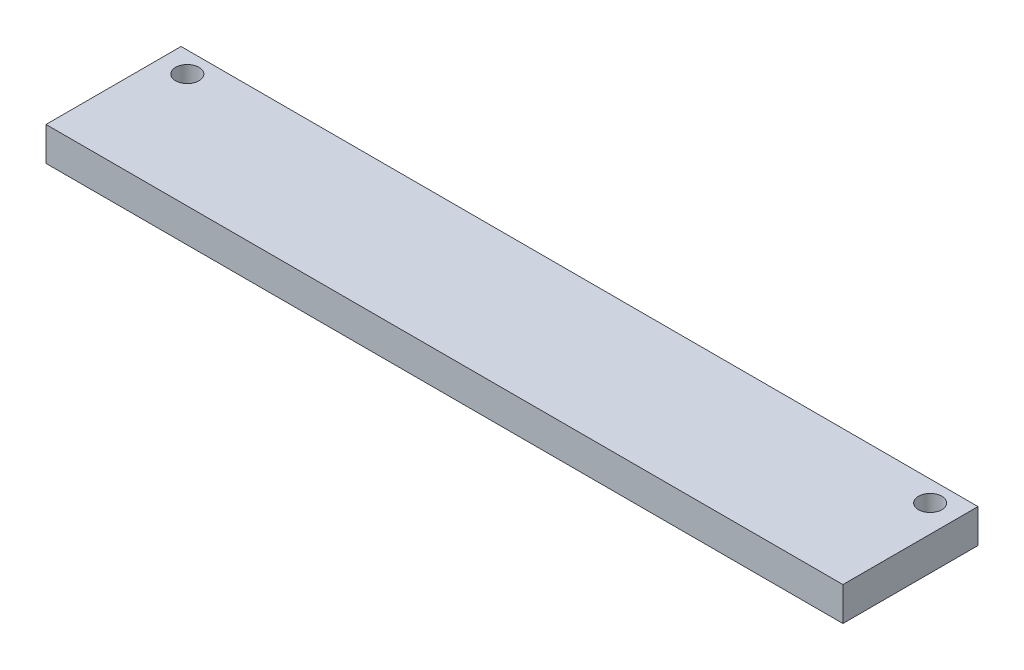
ISO-10303-21;
HEADER;
FILE_DESCRIPTION(('STEP AP214'),'2;1');
FILE_NAME('part.step','',(''),(''),'','','');
FILE_SCHEMA(('AUTOMOTIVE_DESIGN { 1 0 10303 214 1 1 1 1 }'));
ENDSEC;
DATA;
#1=APPLICATION_CONTEXT('core data for automotive mechanical design processes');
#2=APPLICATION_PROTOCOL_DEFINITION('international standard','automotive_design',2000,#1);
#3=PRODUCT_CONTEXT('',#1,'mechanical');
#4=PRODUCT('Part','Part','',(#3));
#5=PRODUCT_RELATED_PRODUCT_CATEGORY('part','',(#4));
#6=PRODUCT_DEFINITION_FORMATION('','',#4);
#7=PRODUCT_DEFINITION_CONTEXT('part definition',#1,'design');
#8=PRODUCT_DEFINITION('design','',#6,#7);
#9=PRODUCT_DEFINITION_SHAPE('','',#8);
#10=(LENGTH_UNIT() NAMED_UNIT(*) SI_UNIT(.MILLI.,.METRE.));
#11=(NAMED_UNIT(*) PLANE_ANGLE_UNIT() SI_UNIT($,.RADIAN.));
#12=(NAMED_UNIT(*) SI_UNIT($,.STERADIAN.) SOLID_ANGLE_UNIT());
#13=UNCERTAINTY_MEASURE_WITH_UNIT(LENGTH_MEASURE(1.E-05),#10,'distance_accuracy_value','');
#14=(GEOMETRIC_REPRESENTATION_CONTEXT(3) GLOBAL_UNCERTAINTY_ASSIGNED_CONTEXT((#13)) GLOBAL_UNIT_ASSIGNED_CONTEXT((#10,
#11,#12)) REPRESENTATION_CONTEXT('',''));
#15=CARTESIAN_POINT('',(0.,0.,0.));
#16=DIRECTION('',(0.,0.,1.));
#17=DIRECTION('',(1.,0.,0.));
#18=AXIS2_PLACEMENT_3D('',#15,#16,#17);
#19=CARTESIAN_POINT('',(-44.8955976868065,3.175,-5.69501312688125));
#20=DIRECTION('',(1.,0.,0.));
#21=DIRECTION('',(0.,0.,-1.));
#22=AXIS2_PLACEMENT_3D('',#19,#20,#21);
#23=PLANE('',#22);
#24=DIRECTION('',(0.,0.,1.));
#25=VECTOR('',#24,1.);
#26=CARTESIAN_POINT('',(-44.8955976868065,0.,-5.69501312688125));
#27=LINE('',#26,#25);
#28=CARTESIAN_POINT('',(-44.8955976868065,0.,-5.69501312688125));
#29=VERTEX_POINT('',#28);
#30=CARTESIAN_POINT('',(-44.8955976868065,0.,7.00498687311875));
#31=VERTEX_POINT('',#30);
#32=EDGE_CURVE('E109',#29,#31,#27,.T.);
#33=ORIENTED_EDGE('',*,*,#32,.T.);
#34=DIRECTION('',(0.,-1.,0.));
#35=VECTOR('',#34,1.);
#36=CARTESIAN_POINT('',(-44.8955976868065,3.175,7.00498687311875));
#37=LINE('',#36,#35);
#38=CARTESIAN_POINT('',(-44.8955976868065,3.175,7.00498687311875));
#39=VERTEX_POINT('',#38);
#40=EDGE_CURVE('E13',#39,#31,#37,.T.);
#41=ORIENTED_EDGE('',*,*,#40,.F.);
#42=DIRECTION('',(0.,0.,1.));
#43=VECTOR('',#42,1.);
#44=CARTESIAN_POINT('',(-44.8955976868065,3.175,-5.69501312688125));
#45=LINE('',#44,#43);
#46=CARTESIAN_POINT('',(-44.8955976868065,3.175,-5.69501312688125));
#47=VERTEX_POINT('',#46);
#48=EDGE_CURVE('E97',#47,#39,#45,.T.);
#49=ORIENTED_EDGE('',*,*,#48,.F.);
#50=DIRECTION('',(0.,-1.,0.));
#51=VECTOR('',#50,1.);
#52=CARTESIAN_POINT('',(-44.8955976868065,3.175,-5.69501312688125));
#53=LINE('',#52,#51);
#54=EDGE_CURVE('E105',#47,#29,#53,.T.);
#55=ORIENTED_EDGE('',*,*,#54,.T.);
#56=EDGE_LOOP('',(#33,#41,#49,#55));
#57=FACE_BOUND('',#56,.T.);
#58=ADVANCED_FACE('F46',(#57),#23,.F.);
#59=CARTESIAN_POINT('',(-44.8955976868065,3.175,7.00498687311875));
#60=DIRECTION('',(0.,0.,-1.));
#61=DIRECTION('',(-1.,0.,0.));
#62=AXIS2_PLACEMENT_3D('',#59,#60,#61);
#63=PLANE('',#62);
#64=DIRECTION('',(1.,0.,0.));
#65=VECTOR('',#64,1.);
#66=CARTESIAN_POINT('',(-44.8955976868065,0.,7.00498687311875));
#67=LINE('',#66,#65);
#68=CARTESIAN_POINT('',(30.0344023131936,0.,7.00498687311875));
#69=VERTEX_POINT('',#68);
#70=EDGE_CURVE('E101',#31,#69,#67,.T.);
#71=ORIENTED_EDGE('',*,*,#70,.T.);
#72=DIRECTION('',(0.,-1.,0.));
#73=VECTOR('',#72,1.);
#74=CARTESIAN_POINT('',(30.0344023131936,3.175,7.00498687311875));
#75=LINE('',#74,#73);
#76=CARTESIAN_POINT('',(30.0344023131936,3.175,7.00498687311875));
#77=VERTEX_POINT('',#76);
#78=EDGE_CURVE('E54',#77,#69,#75,.T.);
#79=ORIENTED_EDGE('',*,*,#78,.F.);
#80=DIRECTION('',(1.,0.,0.));
#81=VECTOR('',#80,1.);
#82=CARTESIAN_POINT('',(-44.8955976868065,3.175,7.00498687311875));
#83=LINE('',#82,#81);
#84=EDGE_CURVE('E92',#39,#77,#83,.T.);
#85=ORIENTED_EDGE('',*,*,#84,.F.);
#86=ORIENTED_EDGE('',*,*,#40,.T.);
#87=EDGE_LOOP('',(#71,#79,#85,#86));
#88=FACE_BOUND('',#87,.T.);
#89=ADVANCED_FACE('F100',(#88),#63,.F.);
#90=CARTESIAN_POINT('',(30.0344023131936,3.175,-5.69501312688125));
#91=DIRECTION('',(-1.,0.,0.));
#92=DIRECTION('',(0.,0.,1.));
#93=AXIS2_PLACEMENT_3D('',#90,#91,#92);
#94=PLANE('',#93);
#95=DIRECTION('',(0.,0.,-1.));
#96=VECTOR('',#95,1.);
#97=CARTESIAN_POINT('',(30.0344023131936,0.,-5.69501312688125));
#98=LINE('',#97,#96);
#99=CARTESIAN_POINT('',(30.0344023131936,0.,-5.69501312688125));
#100=VERTEX_POINT('',#99);
#101=EDGE_CURVE('E79',#69,#100,#98,.T.);
#102=ORIENTED_EDGE('',*,*,#101,.T.);
#103=DIRECTION('',(0.,-1.,0.));
#104=VECTOR('',#103,1.);
#105=CARTESIAN_POINT('',(30.0344023131936,3.175,-5.69501312688125));
#106=LINE('',#105,#104);
#107=CARTESIAN_POINT('',(30.0344023131936,3.175,-5.69501312688125));
#108=VERTEX_POINT('',#107);
#109=EDGE_CURVE('E102',#108,#100,#106,.T.);
#110=ORIENTED_EDGE('',*,*,#109,.F.);
#111=DIRECTION('',(0.,0.,-1.));
#112=VECTOR('',#111,1.);
#113=CARTESIAN_POINT('',(30.0344023131936,3.175,-5.69501312688125));
#114=LINE('',#113,#112);
#115=EDGE_CURVE('E95',#77,#108,#114,.T.);
#116=ORIENTED_EDGE('',*,*,#115,.F.);
#117=ORIENTED_EDGE('',*,*,#78,.T.);
#118=EDGE_LOOP('',(#102,#110,#116,#117));
#119=FACE_BOUND('',#118,.T.);
#120=ADVANCED_FACE('F103',(#119),#94,.F.);
#121=CARTESIAN_POINT('',(-44.8955976868065,3.175,-5.69501312688125));
#122=DIRECTION('',(0.,0.,1.));
#123=DIRECTION('',(1.,0.,0.));
#124=AXIS2_PLACEMENT_3D('',#121,#122,#123);
#125=PLANE('',#124);
#126=DIRECTION('',(-1.,0.,0.));
#127=VECTOR('',#126,1.);
#128=CARTESIAN_POINT('',(-44.8955976868065,0.,-5.69501312688125));
#129=LINE('',#128,#127);
#130=EDGE_CURVE('E85',#100,#29,#129,.T.);
#131=ORIENTED_EDGE('',*,*,#130,.T.);
#132=ORIENTED_EDGE('',*,*,#54,.F.);
#133=DIRECTION('',(-1.,0.,0.));
#134=VECTOR('',#133,1.);
#135=CARTESIAN_POINT('',(-44.8955976868065,3.175,-5.69501312688125));
#136=LINE('',#135,#134);
#137=EDGE_CURVE('E62',#108,#47,#136,.T.);
#138=ORIENTED_EDGE('',*,*,#137,.F.);
#139=ORIENTED_EDGE('',*,*,#109,.T.);
#140=EDGE_LOOP('',(#131,#132,#138,#139));
#141=FACE_BOUND('',#140,.T.);
#142=ADVANCED_FACE('F117',(#141),#125,.F.);
#143=CARTESIAN_POINT('',(0.,3.175,0.));
#144=DIRECTION('',(0.,1.,0.));
#145=DIRECTION('',(0.,0.,1.));
#146=AXIS2_PLACEMENT_3D('',#143,#144,#145);
#147=PLANE('',#146);
#148=CARTESIAN_POINT('',(-42.3555976868064,3.175,-3.73919256098532));
#149=DIRECTION('',(0.,1.,0.));
#150=DIRECTION('',(0.,0.,1.));
#151=AXIS2_PLACEMENT_3D('',#148,#149,#150);
#152=CIRCLE('',#151,1.1);
#153=CARTESIAN_POINT('',(-42.3555976868064,3.175,-2.63919256098532));
#154=VERTEX_POINT('',#153);
#155=EDGE_CURVE('E128',#154,#154,#152,.T.);
#156=ORIENTED_EDGE('',*,*,#155,.F.);
#157=EDGE_LOOP('',(#156));
#158=FACE_BOUND('',#157,.T.);
#159=CARTESIAN_POINT('',(27.4944023131936,3.175,-3.73919256098532));
#160=DIRECTION('',(0.,1.,0.));
#161=DIRECTION('',(0.,0.,1.));
#162=AXIS2_PLACEMENT_3D('',#159,#160,#161);
#163=CIRCLE('',#162,1.1);
#164=CARTESIAN_POINT('',(27.4944023131936,3.175,-2.63919256098532));
#165=VERTEX_POINT('',#164);
#166=EDGE_CURVE('E112',#165,#165,#163,.T.);
#167=ORIENTED_EDGE('',*,*,#166,.F.);
#168=EDGE_LOOP('',(#167));
#169=FACE_BOUND('',#168,.T.);
#170=ORIENTED_EDGE('',*,*,#48,.T.);
#171=ORIENTED_EDGE('',*,*,#84,.T.);
#172=ORIENTED_EDGE('',*,*,#115,.T.);
#173=ORIENTED_EDGE('',*,*,#137,.T.);
#174=EDGE_LOOP('',(#170,#171,#172,#173));
#175=FACE_BOUND('',#174,.T.);
#176=ADVANCED_FACE('F93',(#158,#169,#175),#147,.T.);
#177=CARTESIAN_POINT('',(0.,0.,0.));
#178=DIRECTION('',(0.,1.,0.));
#179=DIRECTION('',(0.,0.,1.));
#180=AXIS2_PLACEMENT_3D('',#177,#178,#179);
#181=PLANE('',#180);
#182=CARTESIAN_POINT('',(-42.3555976868064,0.,-3.73919256098532));
#183=DIRECTION('',(0.,-1.,0.));
#184=DIRECTION('',(0.,0.,-1.));
#185=AXIS2_PLACEMENT_3D('',#182,#183,#184);
#186=CIRCLE('',#185,1.1);
#187=CARTESIAN_POINT('',(-42.3555976868064,0.,-4.83919256098531));
#188=VERTEX_POINT('',#187);
#189=EDGE_CURVE('E131',#188,#188,#186,.T.);
#190=ORIENTED_EDGE('',*,*,#189,.F.);
#191=EDGE_LOOP('',(#190));
#192=FACE_BOUND('',#191,.T.);
#193=CARTESIAN_POINT('',(27.4944023131936,0.,-3.73919256098532));
#194=DIRECTION('',(0.,-1.,0.));
#195=DIRECTION('',(0.,0.,-1.));
#196=AXIS2_PLACEMENT_3D('',#193,#194,#195);
#197=CIRCLE('',#196,1.1);
#198=CARTESIAN_POINT('',(27.4944023131936,0.,-4.83919256098532));
#199=VERTEX_POINT('',#198);
#200=EDGE_CURVE('E125',#199,#199,#197,.T.);
#201=ORIENTED_EDGE('',*,*,#200,.F.);
#202=EDGE_LOOP('',(#201));
#203=FACE_BOUND('',#202,.T.);
#204=ORIENTED_EDGE('',*,*,#32,.F.);
#205=ORIENTED_EDGE('',*,*,#130,.F.);
#206=ORIENTED_EDGE('',*,*,#101,.F.);
#207=ORIENTED_EDGE('',*,*,#70,.F.);
#208=EDGE_LOOP('',(#204,#205,#206,#207));
#209=FACE_BOUND('',#208,.T.);
#210=ADVANCED_FACE('F120',(#192,#203,#209),#181,.F.);
#211=CARTESIAN_POINT('',(27.4944023131936,12.175,-3.73919256098532));
#212=DIRECTION('',(0.,-1.,0.));
#213=DIRECTION('',(0.,0.,-1.));
#214=AXIS2_PLACEMENT_3D('',#211,#212,#213);
#215=CYLINDRICAL_SURFACE('',#214,1.1);
#216=ORIENTED_EDGE('',*,*,#166,.T.);
#217=EDGE_LOOP('',(#216));
#218=FACE_BOUND('',#217,.T.);
#219=ORIENTED_EDGE('',*,*,#200,.T.);
#220=EDGE_LOOP('',(#219));
#221=FACE_BOUND('',#220,.T.);
#222=ADVANCED_FACE('F139',(#218,#221),#215,.F.);
#223=CARTESIAN_POINT('',(-42.3555976868064,12.175,-3.73919256098532));
#224=DIRECTION('',(0.,-1.,0.));
#225=DIRECTION('',(0.,0.,-1.));
#226=AXIS2_PLACEMENT_3D('',#223,#224,#225);
#227=CYLINDRICAL_SURFACE('',#226,1.1);
#228=ORIENTED_EDGE('',*,*,#155,.T.);
#229=EDGE_LOOP('',(#228));
#230=FACE_BOUND('',#229,.T.);
#231=ORIENTED_EDGE('',*,*,#189,.T.);
#232=EDGE_LOOP('',(#231));
#233=FACE_BOUND('',#232,.T.);
#234=ADVANCED_FACE('F135',(#230,#233),#227,.F.);
#235=CLOSED_SHELL('',(#58,#89,#120,#142,#176,#210,#222,#234));
#236=MANIFOLD_SOLID_BREP('B2',#235);
#237=ADVANCED_BREP_SHAPE_REPRESENTATION('',(#18,#236),#14);
#238=SHAPE_DEFINITION_REPRESENTATION(#9,#237);
ENDSEC;
END-ISO-10303-21;
